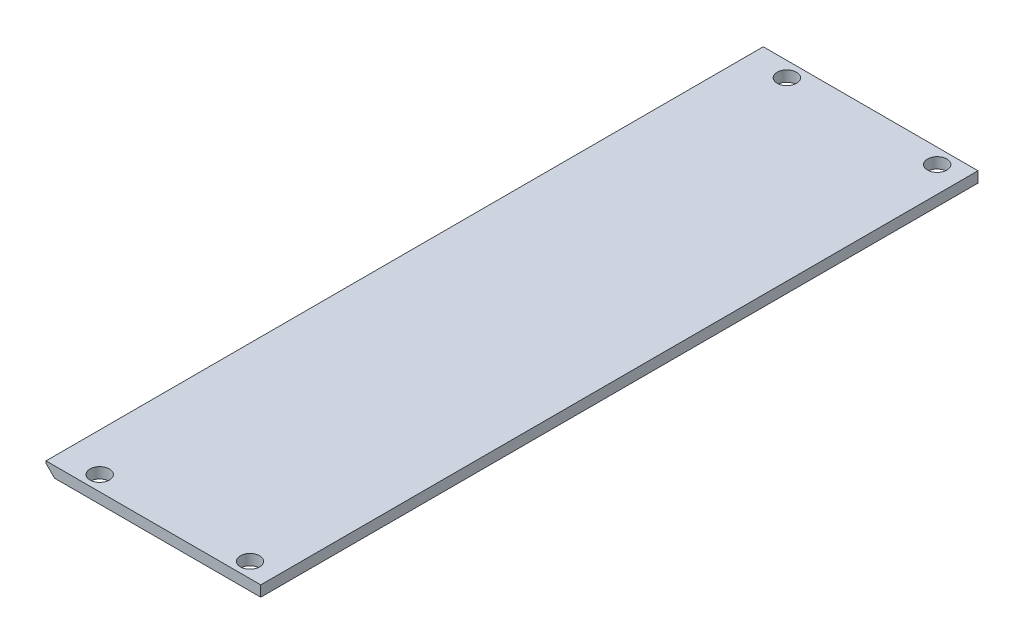
ISO-10303-21;
HEADER;
FILE_DESCRIPTION(('STEP AP214'),'2;1');
FILE_NAME('part.step','',(''),(''),'','','');
FILE_SCHEMA(('AUTOMOTIVE_DESIGN { 1 0 10303 214 1 1 1 1 }'));
ENDSEC;
DATA;
#1=APPLICATION_CONTEXT('core data for automotive mechanical design processes');
#2=APPLICATION_PROTOCOL_DEFINITION('international standard','automotive_design',2000,#1);
#3=PRODUCT_CONTEXT('',#1,'mechanical');
#4=PRODUCT('Part','Part','',(#3));
#5=PRODUCT_RELATED_PRODUCT_CATEGORY('part','',(#4));
#6=PRODUCT_DEFINITION_FORMATION('','',#4);
#7=PRODUCT_DEFINITION_CONTEXT('part definition',#1,'design');
#8=PRODUCT_DEFINITION('design','',#6,#7);
#9=PRODUCT_DEFINITION_SHAPE('','',#8);
#10=(LENGTH_UNIT() NAMED_UNIT(*) SI_UNIT(.MILLI.,.METRE.));
#11=(NAMED_UNIT(*) PLANE_ANGLE_UNIT() SI_UNIT($,.RADIAN.));
#12=(NAMED_UNIT(*) SI_UNIT($,.STERADIAN.) SOLID_ANGLE_UNIT());
#13=UNCERTAINTY_MEASURE_WITH_UNIT(LENGTH_MEASURE(1.E-05),#10,'distance_accuracy_value','');
#14=(GEOMETRIC_REPRESENTATION_CONTEXT(3) GLOBAL_UNCERTAINTY_ASSIGNED_CONTEXT((#13)) GLOBAL_UNIT_ASSIGNED_CONTEXT((#10,
#11,#12)) REPRESENTATION_CONTEXT('',''));
#15=CARTESIAN_POINT('',(0.,0.,0.));
#16=DIRECTION('',(0.,0.,1.));
#17=DIRECTION('',(1.,0.,0.));
#18=AXIS2_PLACEMENT_3D('',#15,#16,#17);
#19=CARTESIAN_POINT('',(0.,5.,167.));
#20=DIRECTION('',(1.,0.,0.));
#21=DIRECTION('',(0.,0.,-1.));
#22=AXIS2_PLACEMENT_3D('',#19,#20,#21);
#23=PLANE('',#22);
#24=DIRECTION('',(0.,-1.,0.));
#25=VECTOR('',#24,1.);
#26=CARTESIAN_POINT('',(0.,5.,-167.));
#27=LINE('',#26,#25);
#28=CARTESIAN_POINT('',(0.,5.,-167.));
#29=VERTEX_POINT('',#28);
#30=CARTESIAN_POINT('',(0.,3.99999999999995,-167.));
#31=VERTEX_POINT('',#30);
#32=EDGE_CURVE('E111',#29,#31,#27,.T.);
#33=ORIENTED_EDGE('',*,*,#32,.T.);
#34=DIRECTION('',(0.,0.,1.));
#35=VECTOR('',#34,1.);
#36=CARTESIAN_POINT('',(0.,3.99999999999995,167.));
#37=LINE('',#36,#35);
#38=CARTESIAN_POINT('',(0.,3.99999999999995,167.));
#39=VERTEX_POINT('',#38);
#40=EDGE_CURVE('E102',#31,#39,#37,.T.);
#41=ORIENTED_EDGE('',*,*,#40,.T.);
#42=DIRECTION('',(0.,-1.,0.));
#43=VECTOR('',#42,1.);
#44=CARTESIAN_POINT('',(0.,5.,167.));
#45=LINE('',#44,#43);
#46=CARTESIAN_POINT('',(0.,5.,167.));
#47=VERTEX_POINT('',#46);
#48=EDGE_CURVE('E83',#47,#39,#45,.T.);
#49=ORIENTED_EDGE('',*,*,#48,.F.);
#50=DIRECTION('',(0.,0.,1.));
#51=VECTOR('',#50,1.);
#52=CARTESIAN_POINT('',(0.,5.,167.));
#53=LINE('',#52,#51);
#54=EDGE_CURVE('E89',#29,#47,#53,.T.);
#55=ORIENTED_EDGE('',*,*,#54,.F.);
#56=EDGE_LOOP('',(#33,#41,#49,#55));
#57=FACE_BOUND('',#56,.T.);
#58=ADVANCED_FACE('F35',(#57),#23,.F.);
#59=CARTESIAN_POINT('',(0.,5.,167.));
#60=DIRECTION('',(0.,0.,-1.));
#61=DIRECTION('',(-1.,0.,0.));
#62=AXIS2_PLACEMENT_3D('',#59,#60,#61);
#63=PLANE('',#62);
#64=ORIENTED_EDGE('',*,*,#48,.T.);
#65=DIRECTION('',(0.707106781186552,-0.707106781186543,0.));
#66=VECTOR('',#65,1.);
#67=CARTESIAN_POINT('',(0.,3.99999999999995,167.));
#68=LINE('',#67,#66);
#69=CARTESIAN_POINT('',(4.,0.,167.));
#70=VERTEX_POINT('',#69);
#71=EDGE_CURVE('E57',#39,#70,#68,.T.);
#72=ORIENTED_EDGE('',*,*,#71,.T.);
#73=DIRECTION('',(1.,0.,0.));
#74=VECTOR('',#73,1.);
#75=CARTESIAN_POINT('',(0.,0.,167.));
#76=LINE('',#75,#74);
#77=CARTESIAN_POINT('',(100.,0.,167.));
#78=VERTEX_POINT('',#77);
#79=EDGE_CURVE('E116',#70,#78,#76,.T.);
#80=ORIENTED_EDGE('',*,*,#79,.T.);
#81=DIRECTION('',(0.,-1.,0.));
#82=VECTOR('',#81,1.);
#83=CARTESIAN_POINT('',(100.,5.,167.));
#84=LINE('',#83,#82);
#85=CARTESIAN_POINT('',(100.,5.,167.));
#86=VERTEX_POINT('',#85);
#87=EDGE_CURVE('E85',#86,#78,#84,.T.);
#88=ORIENTED_EDGE('',*,*,#87,.F.);
#89=DIRECTION('',(1.,0.,0.));
#90=VECTOR('',#89,1.);
#91=CARTESIAN_POINT('',(0.,5.,167.));
#92=LINE('',#91,#90);
#93=EDGE_CURVE('E79',#47,#86,#92,.T.);
#94=ORIENTED_EDGE('',*,*,#93,.F.);
#95=EDGE_LOOP('',(#64,#72,#80,#88,#94));
#96=FACE_BOUND('',#95,.T.);
#97=ADVANCED_FACE('F81',(#96),#63,.F.);
#98=CARTESIAN_POINT('',(100.,5.,167.));
#99=DIRECTION('',(-1.,0.,0.));
#100=DIRECTION('',(0.,0.,1.));
#101=AXIS2_PLACEMENT_3D('',#98,#99,#100);
#102=PLANE('',#101);
#103=DIRECTION('',(0.,0.,-1.));
#104=VECTOR('',#103,1.);
#105=CARTESIAN_POINT('',(100.,0.,167.));
#106=LINE('',#105,#104);
#107=CARTESIAN_POINT('',(99.9999999999999,0.,-167.));
#108=VERTEX_POINT('',#107);
#109=EDGE_CURVE('E114',#78,#108,#106,.T.);
#110=ORIENTED_EDGE('',*,*,#109,.T.);
#111=DIRECTION('',(0.,-1.,0.));
#112=VECTOR('',#111,1.);
#113=CARTESIAN_POINT('',(99.9999999999999,5.,-167.));
#114=LINE('',#113,#112);
#115=CARTESIAN_POINT('',(99.9999999999999,5.,-167.));
#116=VERTEX_POINT('',#115);
#117=EDGE_CURVE('E105',#116,#108,#114,.T.);
#118=ORIENTED_EDGE('',*,*,#117,.F.);
#119=DIRECTION('',(0.,0.,-1.));
#120=VECTOR('',#119,1.);
#121=CARTESIAN_POINT('',(100.,5.,167.));
#122=LINE('',#121,#120);
#123=EDGE_CURVE('E88',#86,#116,#122,.T.);
#124=ORIENTED_EDGE('',*,*,#123,.F.);
#125=ORIENTED_EDGE('',*,*,#87,.T.);
#126=EDGE_LOOP('',(#110,#118,#124,#125));
#127=FACE_BOUND('',#126,.T.);
#128=ADVANCED_FACE('F176',(#127),#102,.F.);
#129=CARTESIAN_POINT('',(0.,5.,-167.));
#130=DIRECTION('',(0.,0.,1.));
#131=DIRECTION('',(1.,0.,0.));
#132=AXIS2_PLACEMENT_3D('',#129,#130,#131);
#133=PLANE('',#132);
#134=DIRECTION('',(-1.,0.,0.));
#135=VECTOR('',#134,1.);
#136=CARTESIAN_POINT('',(0.,0.,-167.));
#137=LINE('',#136,#135);
#138=CARTESIAN_POINT('',(3.99999999999994,0.,-167.));
#139=VERTEX_POINT('',#138);
#140=EDGE_CURVE('E98',#108,#139,#137,.T.);
#141=ORIENTED_EDGE('',*,*,#140,.T.);
#142=DIRECTION('',(-0.707106781186552,0.707106781186543,0.));
#143=VECTOR('',#142,1.);
#144=CARTESIAN_POINT('',(-1.23381024874843E-13,4.00000000000001,-167.));
#145=LINE('',#144,#143);
#146=EDGE_CURVE('E11',#139,#31,#145,.T.);
#147=ORIENTED_EDGE('',*,*,#146,.T.);
#148=ORIENTED_EDGE('',*,*,#32,.F.);
#149=DIRECTION('',(-1.,0.,0.));
#150=VECTOR('',#149,1.);
#151=CARTESIAN_POINT('',(0.,5.,-167.));
#152=LINE('',#151,#150);
#153=EDGE_CURVE('E94',#116,#29,#152,.T.);
#154=ORIENTED_EDGE('',*,*,#153,.F.);
#155=ORIENTED_EDGE('',*,*,#117,.T.);
#156=EDGE_LOOP('',(#141,#147,#148,#154,#155));
#157=FACE_BOUND('',#156,.T.);
#158=ADVANCED_FACE('F150',(#157),#133,.F.);
#159=CARTESIAN_POINT('',(0.,5.,0.));
#160=DIRECTION('',(0.,-1.,0.));
#161=DIRECTION('',(0.,0.,-1.));
#162=AXIS2_PLACEMENT_3D('',#159,#160,#161);
#163=PLANE('',#162);
#164=CARTESIAN_POINT('',(18.0000000000001,5.,160.));
#165=DIRECTION('',(0.,1.,0.));
#166=DIRECTION('',(0.,0.,1.));
#167=AXIS2_PLACEMENT_3D('',#164,#165,#166);
#168=CIRCLE('',#167,4.49999999999999);
#169=CARTESIAN_POINT('',(18.0000000000001,5.,164.5));
#170=VERTEX_POINT('',#169);
#171=EDGE_CURVE('E141',#170,#170,#168,.T.);
#172=ORIENTED_EDGE('',*,*,#171,.F.);
#173=EDGE_LOOP('',(#172));
#174=FACE_BOUND('',#173,.T.);
#175=CARTESIAN_POINT('',(18.,5.,-160.));
#176=DIRECTION('',(0.,1.,0.));
#177=DIRECTION('',(0.,0.,1.));
#178=AXIS2_PLACEMENT_3D('',#175,#176,#177);
#179=CIRCLE('',#178,4.49999999999999);
#180=CARTESIAN_POINT('',(18.,5.,-155.5));
#181=VERTEX_POINT('',#180);
#182=EDGE_CURVE('E135',#181,#181,#179,.T.);
#183=ORIENTED_EDGE('',*,*,#182,.F.);
#184=EDGE_LOOP('',(#183));
#185=FACE_BOUND('',#184,.T.);
#186=CARTESIAN_POINT('',(88.0000000000001,5.,160.));
#187=DIRECTION('',(0.,1.,0.));
#188=DIRECTION('',(0.,0.,1.));
#189=AXIS2_PLACEMENT_3D('',#186,#187,#188);
#190=CIRCLE('',#189,4.49999999999999);
#191=CARTESIAN_POINT('',(88.0000000000001,5.,164.5));
#192=VERTEX_POINT('',#191);
#193=EDGE_CURVE('E129',#192,#192,#190,.T.);
#194=ORIENTED_EDGE('',*,*,#193,.F.);
#195=EDGE_LOOP('',(#194));
#196=FACE_BOUND('',#195,.T.);
#197=CARTESIAN_POINT('',(88.,5.,-160.));
#198=DIRECTION('',(0.,1.,0.));
#199=DIRECTION('',(0.,0.,1.));
#200=AXIS2_PLACEMENT_3D('',#197,#198,#199);
#201=CIRCLE('',#200,4.49999999999999);
#202=CARTESIAN_POINT('',(88.,5.,-155.5));
#203=VERTEX_POINT('',#202);
#204=EDGE_CURVE('E123',#203,#203,#201,.T.);
#205=ORIENTED_EDGE('',*,*,#204,.F.);
#206=EDGE_LOOP('',(#205));
#207=FACE_BOUND('',#206,.T.);
#208=ORIENTED_EDGE('',*,*,#54,.T.);
#209=ORIENTED_EDGE('',*,*,#93,.T.);
#210=ORIENTED_EDGE('',*,*,#123,.T.);
#211=ORIENTED_EDGE('',*,*,#153,.T.);
#212=EDGE_LOOP('',(#208,#209,#210,#211));
#213=FACE_BOUND('',#212,.T.);
#214=ADVANCED_FACE('F92',(#174,#185,#196,#207,#213),#163,.F.);
#215=CARTESIAN_POINT('',(0.,0.,0.));
#216=DIRECTION('',(0.,-1.,0.));
#217=DIRECTION('',(0.,0.,-1.));
#218=AXIS2_PLACEMENT_3D('',#215,#216,#217);
#219=PLANE('',#218);
#220=CARTESIAN_POINT('',(18.0000000000001,0.,160.));
#221=DIRECTION('',(0.,1.,0.));
#222=DIRECTION('',(0.,0.,1.));
#223=AXIS2_PLACEMENT_3D('',#220,#221,#222);
#224=CIRCLE('',#223,4.5);
#225=CARTESIAN_POINT('',(18.0000000000001,0.,164.5));
#226=VERTEX_POINT('',#225);
#227=EDGE_CURVE('E138',#226,#226,#224,.T.);
#228=ORIENTED_EDGE('',*,*,#227,.T.);
#229=EDGE_LOOP('',(#228));
#230=FACE_BOUND('',#229,.T.);
#231=CARTESIAN_POINT('',(18.,0.,-160.));
#232=DIRECTION('',(0.,1.,0.));
#233=DIRECTION('',(0.,0.,1.));
#234=AXIS2_PLACEMENT_3D('',#231,#232,#233);
#235=CIRCLE('',#234,4.5);
#236=CARTESIAN_POINT('',(18.,0.,-155.5));
#237=VERTEX_POINT('',#236);
#238=EDGE_CURVE('E132',#237,#237,#235,.T.);
#239=ORIENTED_EDGE('',*,*,#238,.T.);
#240=EDGE_LOOP('',(#239));
#241=FACE_BOUND('',#240,.T.);
#242=CARTESIAN_POINT('',(88.0000000000001,0.,160.));
#243=DIRECTION('',(0.,1.,0.));
#244=DIRECTION('',(0.,0.,1.));
#245=AXIS2_PLACEMENT_3D('',#242,#243,#244);
#246=CIRCLE('',#245,4.5);
#247=CARTESIAN_POINT('',(88.0000000000001,0.,164.5));
#248=VERTEX_POINT('',#247);
#249=EDGE_CURVE('E126',#248,#248,#246,.T.);
#250=ORIENTED_EDGE('',*,*,#249,.T.);
#251=EDGE_LOOP('',(#250));
#252=FACE_BOUND('',#251,.T.);
#253=CARTESIAN_POINT('',(88.,0.,-160.));
#254=DIRECTION('',(0.,1.,0.));
#255=DIRECTION('',(0.,0.,1.));
#256=AXIS2_PLACEMENT_3D('',#253,#254,#255);
#257=CIRCLE('',#256,4.5);
#258=CARTESIAN_POINT('',(88.,0.,-155.5));
#259=VERTEX_POINT('',#258);
#260=EDGE_CURVE('E118',#259,#259,#257,.T.);
#261=ORIENTED_EDGE('',*,*,#260,.T.);
#262=EDGE_LOOP('',(#261));
#263=FACE_BOUND('',#262,.T.);
#264=ORIENTED_EDGE('',*,*,#79,.F.);
#265=DIRECTION('',(0.,0.,-1.));
#266=VECTOR('',#265,1.);
#267=CARTESIAN_POINT('',(3.99999999999994,0.,-167.));
#268=LINE('',#267,#266);
#269=EDGE_CURVE('E43',#70,#139,#268,.T.);
#270=ORIENTED_EDGE('',*,*,#269,.T.);
#271=ORIENTED_EDGE('',*,*,#140,.F.);
#272=ORIENTED_EDGE('',*,*,#109,.F.);
#273=EDGE_LOOP('',(#264,#270,#271,#272));
#274=FACE_BOUND('',#273,.T.);
#275=ADVANCED_FACE('F149',(#230,#241,#252,#263,#274),#219,.T.);
#276=CARTESIAN_POINT('',(0.,3.99999999999995,167.));
#277=DIRECTION('',(-0.707106781186543,-0.707106781186552,0.));
#278=DIRECTION('',(0.,0.,-1.));
#279=AXIS2_PLACEMENT_3D('',#276,#277,#278);
#280=PLANE('',#279);
#281=ORIENTED_EDGE('',*,*,#146,.F.);
#282=ORIENTED_EDGE('',*,*,#269,.F.);
#283=ORIENTED_EDGE('',*,*,#71,.F.);
#284=ORIENTED_EDGE('',*,*,#40,.F.);
#285=EDGE_LOOP('',(#281,#282,#283,#284));
#286=FACE_BOUND('',#285,.T.);
#287=ADVANCED_FACE('F37',(#286),#280,.T.);
#288=CARTESIAN_POINT('',(88.,5.,-160.));
#289=DIRECTION('',(0.,1.,0.));
#290=DIRECTION('',(0.,0.,1.));
#291=AXIS2_PLACEMENT_3D('',#288,#289,#290);
#292=CYLINDRICAL_SURFACE('',#291,4.5);
#293=ORIENTED_EDGE('',*,*,#260,.F.);
#294=EDGE_LOOP('',(#293));
#295=FACE_BOUND('',#294,.T.);
#296=ORIENTED_EDGE('',*,*,#204,.T.);
#297=EDGE_LOOP('',(#296));
#298=FACE_BOUND('',#297,.T.);
#299=ADVANCED_FACE('F158',(#295,#298),#292,.F.);
#300=CARTESIAN_POINT('',(88.0000000000001,5.,160.));
#301=DIRECTION('',(0.,1.,0.));
#302=DIRECTION('',(0.,0.,1.));
#303=AXIS2_PLACEMENT_3D('',#300,#301,#302);
#304=CYLINDRICAL_SURFACE('',#303,4.5);
#305=ORIENTED_EDGE('',*,*,#249,.F.);
#306=EDGE_LOOP('',(#305));
#307=FACE_BOUND('',#306,.T.);
#308=ORIENTED_EDGE('',*,*,#193,.T.);
#309=EDGE_LOOP('',(#308));
#310=FACE_BOUND('',#309,.T.);
#311=ADVANCED_FACE('F160',(#307,#310),#304,.F.);
#312=CARTESIAN_POINT('',(18.,5.,-160.));
#313=DIRECTION('',(0.,1.,0.));
#314=DIRECTION('',(0.,0.,1.));
#315=AXIS2_PLACEMENT_3D('',#312,#313,#314);
#316=CYLINDRICAL_SURFACE('',#315,4.5);
#317=ORIENTED_EDGE('',*,*,#238,.F.);
#318=EDGE_LOOP('',(#317));
#319=FACE_BOUND('',#318,.T.);
#320=ORIENTED_EDGE('',*,*,#182,.T.);
#321=EDGE_LOOP('',(#320));
#322=FACE_BOUND('',#321,.T.);
#323=ADVANCED_FACE('F167',(#319,#322),#316,.F.);
#324=CARTESIAN_POINT('',(18.0000000000001,5.,160.));
#325=DIRECTION('',(0.,1.,0.));
#326=DIRECTION('',(0.,0.,1.));
#327=AXIS2_PLACEMENT_3D('',#324,#325,#326);
#328=CYLINDRICAL_SURFACE('',#327,4.49999999999999);
#329=ORIENTED_EDGE('',*,*,#227,.F.);
#330=EDGE_LOOP('',(#329));
#331=FACE_BOUND('',#330,.T.);
#332=ORIENTED_EDGE('',*,*,#171,.T.);
#333=EDGE_LOOP('',(#332));
#334=FACE_BOUND('',#333,.T.);
#335=ADVANCED_FACE('F145',(#331,#334),#328,.F.);
#336=CLOSED_SHELL('',(#58,#97,#128,#158,#214,#275,#287,#299,#311,#323,#335));
#337=MANIFOLD_SOLID_BREP('B2',#336);
#338=ADVANCED_BREP_SHAPE_REPRESENTATION('',(#18,#337),#14);
#339=SHAPE_DEFINITION_REPRESENTATION(#9,#338);
ENDSEC;
END-ISO-10303-21;
